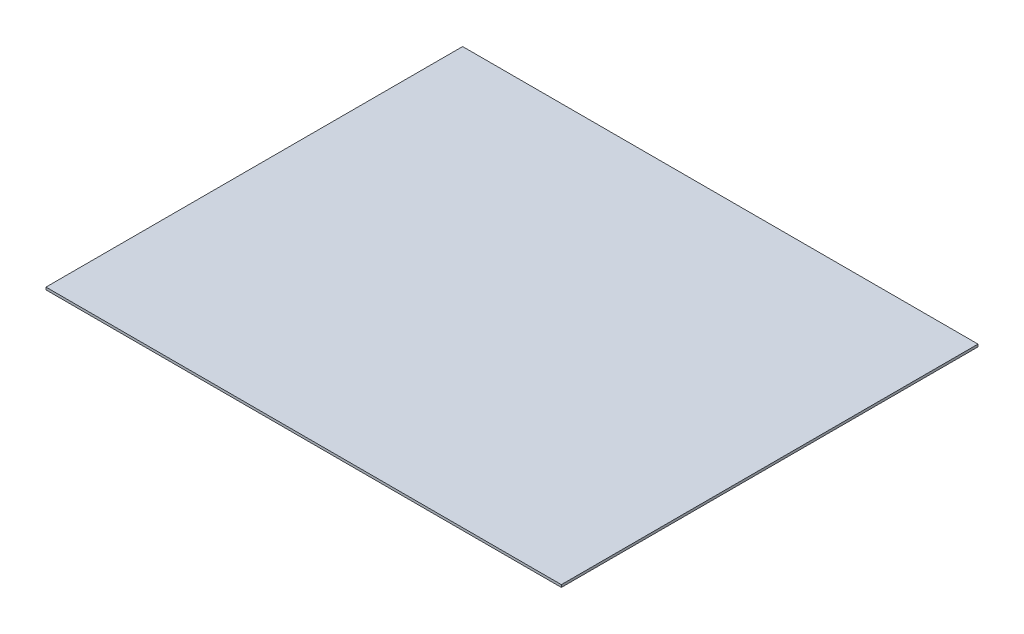
ISO-10303-21;
HEADER;
FILE_DESCRIPTION(('STEP AP214'),'2;1');
FILE_NAME('part.step','',(''),(''),'','','');
FILE_SCHEMA(('AUTOMOTIVE_DESIGN { 1 0 10303 214 1 1 1 1 }'));
ENDSEC;
DATA;
#1=APPLICATION_CONTEXT('core data for automotive mechanical design processes');
#2=APPLICATION_PROTOCOL_DEFINITION('international standard','automotive_design',2000,#1);
#3=PRODUCT_CONTEXT('',#1,'mechanical');
#4=PRODUCT('Part','Part','',(#3));
#5=PRODUCT_RELATED_PRODUCT_CATEGORY('part','',(#4));
#6=PRODUCT_DEFINITION_FORMATION('','',#4);
#7=PRODUCT_DEFINITION_CONTEXT('part definition',#1,'design');
#8=PRODUCT_DEFINITION('design','',#6,#7);
#9=PRODUCT_DEFINITION_SHAPE('','',#8);
#10=(LENGTH_UNIT() NAMED_UNIT(*) SI_UNIT(.MILLI.,.METRE.));
#11=(NAMED_UNIT(*) PLANE_ANGLE_UNIT() SI_UNIT($,.RADIAN.));
#12=(NAMED_UNIT(*) SI_UNIT($,.STERADIAN.) SOLID_ANGLE_UNIT());
#13=UNCERTAINTY_MEASURE_WITH_UNIT(LENGTH_MEASURE(1.E-05),#10,'distance_accuracy_value','');
#14=(GEOMETRIC_REPRESENTATION_CONTEXT(3) GLOBAL_UNCERTAINTY_ASSIGNED_CONTEXT((#13)) GLOBAL_UNIT_ASSIGNED_CONTEXT((#10,
#11,#12)) REPRESENTATION_CONTEXT('',''));
#15=CARTESIAN_POINT('',(0.,0.,0.));
#16=DIRECTION('',(0.,0.,1.));
#17=DIRECTION('',(1.,0.,0.));
#18=AXIS2_PLACEMENT_3D('',#15,#16,#17);
#19=CARTESIAN_POINT('',(0.,1.25,0.));
#20=DIRECTION('',(1.,0.,0.));
#21=DIRECTION('',(0.,0.,-1.));
#22=AXIS2_PLACEMENT_3D('',#19,#20,#21);
#23=PLANE('',#22);
#24=DIRECTION('',(0.,0.,1.));
#25=VECTOR('',#24,1.);
#26=CARTESIAN_POINT('',(0.,0.,0.));
#27=LINE('',#26,#25);
#28=CARTESIAN_POINT('',(-1.11022302462516E-13,0.,-211.));
#29=VERTEX_POINT('',#28);
#30=CARTESIAN_POINT('',(0.,0.,0.));
#31=VERTEX_POINT('',#30);
#32=EDGE_CURVE('E107',#29,#31,#27,.T.);
#33=ORIENTED_EDGE('',*,*,#32,.T.);
#34=DIRECTION('',(0.,-1.,0.));
#35=VECTOR('',#34,1.);
#36=CARTESIAN_POINT('',(0.,1.25,0.));
#37=LINE('',#36,#35);
#38=CARTESIAN_POINT('',(0.,1.25,0.));
#39=VERTEX_POINT('',#38);
#40=EDGE_CURVE('E11',#39,#31,#37,.T.);
#41=ORIENTED_EDGE('',*,*,#40,.F.);
#42=DIRECTION('',(0.,0.,1.));
#43=VECTOR('',#42,1.);
#44=CARTESIAN_POINT('',(0.,1.25,0.));
#45=LINE('',#44,#43);
#46=CARTESIAN_POINT('',(-1.11022302462516E-13,1.25,-211.));
#47=VERTEX_POINT('',#46);
#48=EDGE_CURVE('E91',#47,#39,#45,.T.);
#49=ORIENTED_EDGE('',*,*,#48,.F.);
#50=DIRECTION('',(0.,-1.,0.));
#51=VECTOR('',#50,1.);
#52=CARTESIAN_POINT('',(-1.11022302462516E-13,1.25,-211.));
#53=LINE('',#52,#51);
#54=EDGE_CURVE('E103',#47,#29,#53,.T.);
#55=ORIENTED_EDGE('',*,*,#54,.T.);
#56=EDGE_LOOP('',(#33,#41,#49,#55));
#57=FACE_BOUND('',#56,.T.);
#58=ADVANCED_FACE('F39',(#57),#23,.F.);
#59=CARTESIAN_POINT('',(0.,1.25,0.));
#60=DIRECTION('',(0.,0.,-1.));
#61=DIRECTION('',(-1.,0.,0.));
#62=AXIS2_PLACEMENT_3D('',#59,#60,#61);
#63=PLANE('',#62);
#64=DIRECTION('',(1.,0.,0.));
#65=VECTOR('',#64,1.);
#66=CARTESIAN_POINT('',(0.,0.,0.));
#67=LINE('',#66,#65);
#68=CARTESIAN_POINT('',(261.,0.,0.));
#69=VERTEX_POINT('',#68);
#70=EDGE_CURVE('E96',#31,#69,#67,.T.);
#71=ORIENTED_EDGE('',*,*,#70,.T.);
#72=DIRECTION('',(0.,-1.,0.));
#73=VECTOR('',#72,1.);
#74=CARTESIAN_POINT('',(261.,1.25,0.));
#75=LINE('',#74,#73);
#76=CARTESIAN_POINT('',(261.,1.25,0.));
#77=VERTEX_POINT('',#76);
#78=EDGE_CURVE('E48',#77,#69,#75,.T.);
#79=ORIENTED_EDGE('',*,*,#78,.F.);
#80=DIRECTION('',(1.,0.,0.));
#81=VECTOR('',#80,1.);
#82=CARTESIAN_POINT('',(0.,1.25,0.));
#83=LINE('',#82,#81);
#84=EDGE_CURVE('E86',#39,#77,#83,.T.);
#85=ORIENTED_EDGE('',*,*,#84,.F.);
#86=ORIENTED_EDGE('',*,*,#40,.T.);
#87=EDGE_LOOP('',(#71,#79,#85,#86));
#88=FACE_BOUND('',#87,.T.);
#89=ADVANCED_FACE('F95',(#88),#63,.F.);
#90=CARTESIAN_POINT('',(261.,1.25,0.));
#91=DIRECTION('',(-1.,0.,0.));
#92=DIRECTION('',(0.,0.,1.));
#93=AXIS2_PLACEMENT_3D('',#90,#91,#92);
#94=PLANE('',#93);
#95=DIRECTION('',(0.,0.,-1.));
#96=VECTOR('',#95,1.);
#97=CARTESIAN_POINT('',(261.,0.,0.));
#98=LINE('',#97,#96);
#99=CARTESIAN_POINT('',(261.,0.,-211.));
#100=VERTEX_POINT('',#99);
#101=EDGE_CURVE('E73',#69,#100,#98,.T.);
#102=ORIENTED_EDGE('',*,*,#101,.T.);
#103=DIRECTION('',(0.,-1.,0.));
#104=VECTOR('',#103,1.);
#105=CARTESIAN_POINT('',(261.,1.25,-211.));
#106=LINE('',#105,#104);
#107=CARTESIAN_POINT('',(261.,1.25,-211.));
#108=VERTEX_POINT('',#107);
#109=EDGE_CURVE('E98',#108,#100,#106,.T.);
#110=ORIENTED_EDGE('',*,*,#109,.F.);
#111=DIRECTION('',(0.,0.,-1.));
#112=VECTOR('',#111,1.);
#113=CARTESIAN_POINT('',(261.,1.25,0.));
#114=LINE('',#113,#112);
#115=EDGE_CURVE('E89',#77,#108,#114,.T.);
#116=ORIENTED_EDGE('',*,*,#115,.F.);
#117=ORIENTED_EDGE('',*,*,#78,.T.);
#118=EDGE_LOOP('',(#102,#110,#116,#117));
#119=FACE_BOUND('',#118,.T.);
#120=ADVANCED_FACE('F99',(#119),#94,.F.);
#121=CARTESIAN_POINT('',(-1.11022302462516E-13,1.25,-211.));
#122=DIRECTION('',(0.,0.,1.));
#123=DIRECTION('',(1.,0.,0.));
#124=AXIS2_PLACEMENT_3D('',#121,#122,#123);
#125=PLANE('',#124);
#126=DIRECTION('',(-1.,0.,0.));
#127=VECTOR('',#126,1.);
#128=CARTESIAN_POINT('',(-1.11022302462516E-13,0.,-211.));
#129=LINE('',#128,#127);
#130=EDGE_CURVE('E79',#100,#29,#129,.T.);
#131=ORIENTED_EDGE('',*,*,#130,.T.);
#132=ORIENTED_EDGE('',*,*,#54,.F.);
#133=DIRECTION('',(-1.,0.,0.));
#134=VECTOR('',#133,1.);
#135=CARTESIAN_POINT('',(-1.11022302462516E-13,1.25,-211.));
#136=LINE('',#135,#134);
#137=EDGE_CURVE('E56',#108,#47,#136,.T.);
#138=ORIENTED_EDGE('',*,*,#137,.F.);
#139=ORIENTED_EDGE('',*,*,#109,.T.);
#140=EDGE_LOOP('',(#131,#132,#138,#139));
#141=FACE_BOUND('',#140,.T.);
#142=ADVANCED_FACE('F120',(#141),#125,.F.);
#143=CARTESIAN_POINT('',(0.,1.25,0.));
#144=DIRECTION('',(0.,-1.,0.));
#145=DIRECTION('',(0.,0.,-1.));
#146=AXIS2_PLACEMENT_3D('',#143,#144,#145);
#147=PLANE('',#146);
#148=ORIENTED_EDGE('',*,*,#48,.T.);
#149=ORIENTED_EDGE('',*,*,#84,.T.);
#150=ORIENTED_EDGE('',*,*,#115,.T.);
#151=ORIENTED_EDGE('',*,*,#137,.T.);
#152=EDGE_LOOP('',(#148,#149,#150,#151));
#153=FACE_BOUND('',#152,.T.);
#154=ADVANCED_FACE('F87',(#153),#147,.F.);
#155=CARTESIAN_POINT('',(0.,0.,0.));
#156=DIRECTION('',(0.,-1.,0.));
#157=DIRECTION('',(0.,0.,-1.));
#158=AXIS2_PLACEMENT_3D('',#155,#156,#157);
#159=PLANE('',#158);
#160=ORIENTED_EDGE('',*,*,#32,.F.);
#161=ORIENTED_EDGE('',*,*,#130,.F.);
#162=ORIENTED_EDGE('',*,*,#101,.F.);
#163=ORIENTED_EDGE('',*,*,#70,.F.);
#164=EDGE_LOOP('',(#160,#161,#162,#163));
#165=FACE_BOUND('',#164,.T.);
#166=ADVANCED_FACE('F123',(#165),#159,.T.);
#167=CLOSED_SHELL('',(#58,#89,#120,#142,#154,#166));
#168=MANIFOLD_SOLID_BREP('B2',#167);
#169=ADVANCED_BREP_SHAPE_REPRESENTATION('',(#18,#168),#14);
#170=SHAPE_DEFINITION_REPRESENTATION(#9,#169);
ENDSEC;
END-ISO-10303-21;
